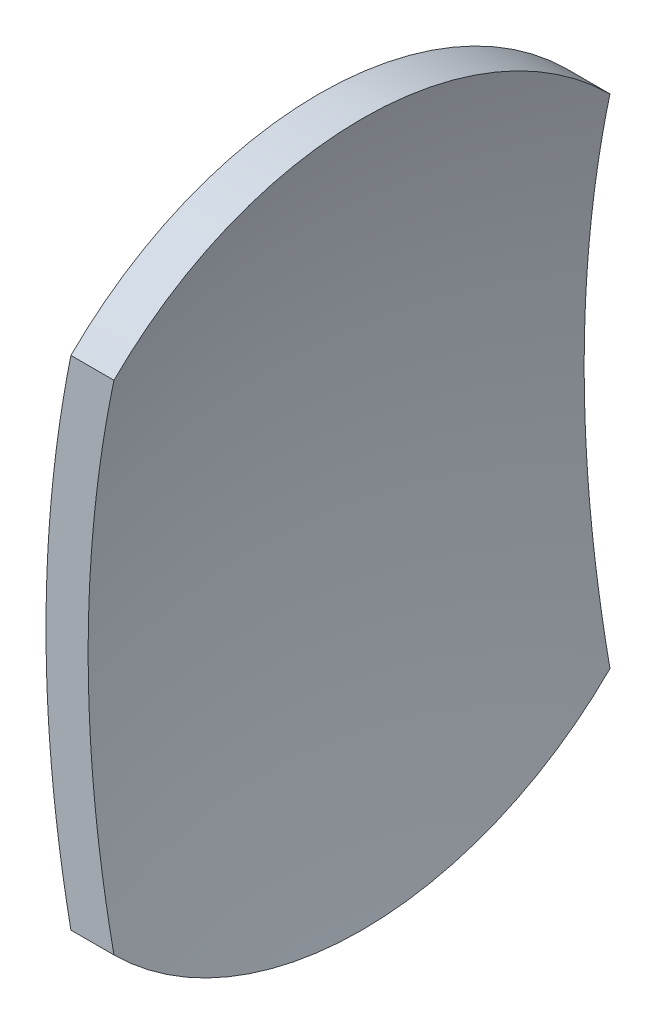
ISO-10303-21;
HEADER;
FILE_DESCRIPTION(('STEP AP214'),'2;1');
FILE_NAME('part.step','',(''),(''),'','','');
FILE_SCHEMA(('AUTOMOTIVE_DESIGN { 1 0 10303 214 1 1 1 1 }'));
ENDSEC;
DATA;
#1=APPLICATION_CONTEXT('core data for automotive mechanical design processes');
#2=APPLICATION_PROTOCOL_DEFINITION('international standard','automotive_design',2000,#1);
#3=PRODUCT_CONTEXT('',#1,'mechanical');
#4=PRODUCT('Part','Part','',(#3));
#5=PRODUCT_RELATED_PRODUCT_CATEGORY('part','',(#4));
#6=PRODUCT_DEFINITION_FORMATION('','',#4);
#7=PRODUCT_DEFINITION_CONTEXT('part definition',#1,'design');
#8=PRODUCT_DEFINITION('design','',#6,#7);
#9=PRODUCT_DEFINITION_SHAPE('','',#8);
#10=(LENGTH_UNIT() NAMED_UNIT(*) SI_UNIT(.MILLI.,.METRE.));
#11=(NAMED_UNIT(*) PLANE_ANGLE_UNIT() SI_UNIT($,.RADIAN.));
#12=(NAMED_UNIT(*) SI_UNIT($,.STERADIAN.) SOLID_ANGLE_UNIT());
#13=UNCERTAINTY_MEASURE_WITH_UNIT(LENGTH_MEASURE(1.E-05),#10,'distance_accuracy_value','');
#14=(GEOMETRIC_REPRESENTATION_CONTEXT(3) GLOBAL_UNCERTAINTY_ASSIGNED_CONTEXT((#13)) GLOBAL_UNIT_ASSIGNED_CONTEXT((#10,
#11,#12)) REPRESENTATION_CONTEXT('',''));
#15=CARTESIAN_POINT('',(0.,0.,0.));
#16=DIRECTION('',(0.,0.,1.));
#17=DIRECTION('',(1.,0.,0.));
#18=AXIS2_PLACEMENT_3D('',#15,#16,#17);
#19=CARTESIAN_POINT('',(0.,0.,0.));
#20=DIRECTION('',(1.,0.,0.));
#21=DIRECTION('',(0.,0.,-1.));
#22=AXIS2_PLACEMENT_3D('',#19,#20,#21);
#23=CYLINDRICAL_SURFACE('',#22,17.);
#24=DIRECTION('',(1.,0.,0.));
#25=VECTOR('',#24,1.);
#26=CARTESIAN_POINT('',(-62.001,12.0415945787923,12.));
#27=LINE('',#26,#25);
#28=CARTESIAN_POINT('',(-59.6238207430554,12.0415945787923,12.));
#29=VERTEX_POINT('',#28);
#30=CARTESIAN_POINT('',(-57.5412895232632,12.0415945787923,12.));
#31=VERTEX_POINT('',#30);
#32=EDGE_CURVE('E63',#29,#31,#27,.T.);
#33=ORIENTED_EDGE('',*,*,#32,.T.);
#34=CARTESIAN_POINT('',(-57.5412895232632,0.,0.));
#35=DIRECTION('',(1.,0.,0.));
#36=DIRECTION('',(0.,0.,-1.));
#37=AXIS2_PLACEMENT_3D('',#34,#35,#36);
#38=CIRCLE('',#37,17.);
#39=CARTESIAN_POINT('',(-57.5412895232632,12.0415945787923,-12.));
#40=VERTEX_POINT('',#39);
#41=EDGE_CURVE('E12',#40,#31,#38,.T.);
#42=ORIENTED_EDGE('',*,*,#41,.F.);
#43=DIRECTION('',(1.,0.,0.));
#44=VECTOR('',#43,1.);
#45=CARTESIAN_POINT('',(-62.001,12.0415945787923,-12.));
#46=LINE('',#45,#44);
#47=CARTESIAN_POINT('',(-59.6238207430554,12.0415945787923,-12.));
#48=VERTEX_POINT('',#47);
#49=EDGE_CURVE('E95',#48,#40,#46,.T.);
#50=ORIENTED_EDGE('',*,*,#49,.F.);
#51=CARTESIAN_POINT('',(-59.6238207430554,0.,0.));
#52=DIRECTION('',(1.,0.,0.));
#53=DIRECTION('',(0.,0.,-1.));
#54=AXIS2_PLACEMENT_3D('',#51,#52,#53);
#55=CIRCLE('',#54,17.);
#56=EDGE_CURVE('E99',#48,#29,#55,.T.);
#57=ORIENTED_EDGE('',*,*,#56,.T.);
#58=EDGE_LOOP('',(#33,#42,#50,#57));
#59=FACE_BOUND('',#58,.T.);
#60=ADVANCED_FACE('F40',(#59),#23,.T.);
#61=CARTESIAN_POINT('',(0.,0.,0.));
#62=DIRECTION('',(1.,0.,0.));
#63=DIRECTION('',(0.,1.,0.));
#64=AXIS2_PLACEMENT_3D('',#61,#62,#63);
#65=SPHERICAL_SURFACE('',#64,60.);
#66=CARTESIAN_POINT('',(0.,0.,12.));
#67=DIRECTION('',(0.,0.,-1.));
#68=DIRECTION('',(-1.,0.,0.));
#69=AXIS2_PLACEMENT_3D('',#66,#67,#68);
#70=CIRCLE('',#69,58.7877538267963);
#71=CARTESIAN_POINT('',(-57.5412895232632,-12.0415945787923,12.));
#72=VERTEX_POINT('',#71);
#73=EDGE_CURVE('E87',#31,#72,#70,.F.);
#74=ORIENTED_EDGE('',*,*,#73,.T.);
#75=CARTESIAN_POINT('',(-57.5412895232632,-12.0415945787923,-12.));
#76=VERTEX_POINT('',#75);
#77=EDGE_CURVE('E48',#72,#76,#38,.T.);
#78=ORIENTED_EDGE('',*,*,#77,.T.);
#79=CARTESIAN_POINT('',(0.,0.,-12.));
#80=DIRECTION('',(0.,0.,1.));
#81=DIRECTION('',(1.,0.,0.));
#82=AXIS2_PLACEMENT_3D('',#79,#80,#81);
#83=CIRCLE('',#82,58.7877538267963);
#84=EDGE_CURVE('E105',#76,#40,#83,.F.);
#85=ORIENTED_EDGE('',*,*,#84,.T.);
#86=ORIENTED_EDGE('',*,*,#41,.T.);
#87=EDGE_LOOP('',(#74,#78,#85,#86));
#88=FACE_BOUND('',#87,.T.);
#89=ADVANCED_FACE('F42',(#88),#65,.F.);
#90=DIRECTION('',(1.,0.,0.));
#91=VECTOR('',#90,1.);
#92=CARTESIAN_POINT('',(-62.001,-12.0415945787923,12.));
#93=LINE('',#92,#91);
#94=CARTESIAN_POINT('',(-59.6238207430554,-12.0415945787923,12.));
#95=VERTEX_POINT('',#94);
#96=EDGE_CURVE('E81',#95,#72,#93,.T.);
#97=ORIENTED_EDGE('',*,*,#96,.F.);
#98=CARTESIAN_POINT('',(-59.6238207430554,-12.0415945787923,-12.));
#99=VERTEX_POINT('',#98);
#100=EDGE_CURVE('E93',#95,#99,#55,.T.);
#101=ORIENTED_EDGE('',*,*,#100,.T.);
#102=DIRECTION('',(1.,0.,0.));
#103=VECTOR('',#102,1.);
#104=CARTESIAN_POINT('',(-62.001,-12.0415945787923,-12.));
#105=LINE('',#104,#103);
#106=EDGE_CURVE('E55',#99,#76,#105,.T.);
#107=ORIENTED_EDGE('',*,*,#106,.T.);
#108=ORIENTED_EDGE('',*,*,#77,.F.);
#109=EDGE_LOOP('',(#97,#101,#107,#108));
#110=FACE_BOUND('',#109,.T.);
#111=ADVANCED_FACE('F92',(#110),#23,.T.);
#112=CARTESIAN_POINT('',(0.,0.,0.));
#113=DIRECTION('',(1.,0.,0.));
#114=DIRECTION('',(0.,1.,0.));
#115=AXIS2_PLACEMENT_3D('',#112,#113,#114);
#116=SPHERICAL_SURFACE('',#115,62.);
#117=CARTESIAN_POINT('',(0.,0.,12.));
#118=DIRECTION('',(0.,0.,-1.));
#119=DIRECTION('',(-1.,0.,0.));
#120=AXIS2_PLACEMENT_3D('',#117,#118,#119);
#121=CIRCLE('',#120,60.8276253029822);
#122=EDGE_CURVE('E78',#95,#29,#121,.T.);
#123=ORIENTED_EDGE('',*,*,#122,.T.);
#124=ORIENTED_EDGE('',*,*,#56,.F.);
#125=CARTESIAN_POINT('',(0.,0.,-12.));
#126=DIRECTION('',(0.,0.,1.));
#127=DIRECTION('',(1.,0.,0.));
#128=AXIS2_PLACEMENT_3D('',#125,#126,#127);
#129=CIRCLE('',#128,60.8276253029822);
#130=EDGE_CURVE('E98',#48,#99,#129,.T.);
#131=ORIENTED_EDGE('',*,*,#130,.T.);
#132=ORIENTED_EDGE('',*,*,#100,.F.);
#133=EDGE_LOOP('',(#123,#124,#131,#132));
#134=FACE_BOUND('',#133,.T.);
#135=ADVANCED_FACE('F97',(#134),#116,.T.);
#136=CARTESIAN_POINT('',(-62.001,12.0415945787923,-12.));
#137=DIRECTION('',(0.,0.,1.));
#138=DIRECTION('',(1.,0.,0.));
#139=AXIS2_PLACEMENT_3D('',#136,#137,#138);
#140=PLANE('',#139);
#141=ORIENTED_EDGE('',*,*,#106,.F.);
#142=ORIENTED_EDGE('',*,*,#130,.F.);
#143=ORIENTED_EDGE('',*,*,#49,.T.);
#144=ORIENTED_EDGE('',*,*,#84,.F.);
#145=EDGE_LOOP('',(#141,#142,#143,#144));
#146=FACE_BOUND('',#145,.T.);
#147=ADVANCED_FACE('F112',(#146),#140,.F.);
#148=CARTESIAN_POINT('',(-62.001,12.0415945787923,12.));
#149=DIRECTION('',(0.,0.,-1.));
#150=DIRECTION('',(-1.,0.,0.));
#151=AXIS2_PLACEMENT_3D('',#148,#149,#150);
#152=PLANE('',#151);
#153=ORIENTED_EDGE('',*,*,#32,.F.);
#154=ORIENTED_EDGE('',*,*,#122,.F.);
#155=ORIENTED_EDGE('',*,*,#96,.T.);
#156=ORIENTED_EDGE('',*,*,#73,.F.);
#157=EDGE_LOOP('',(#153,#154,#155,#156));
#158=FACE_BOUND('',#157,.T.);
#159=ADVANCED_FACE('F80',(#158),#152,.F.);
#160=CLOSED_SHELL('',(#60,#89,#111,#135,#147,#159));
#161=MANIFOLD_SOLID_BREP('B2',#160);
#162=ADVANCED_BREP_SHAPE_REPRESENTATION('',(#18,#161),#14);
#163=SHAPE_DEFINITION_REPRESENTATION(#9,#162);
ENDSEC;
END-ISO-10303-21;
